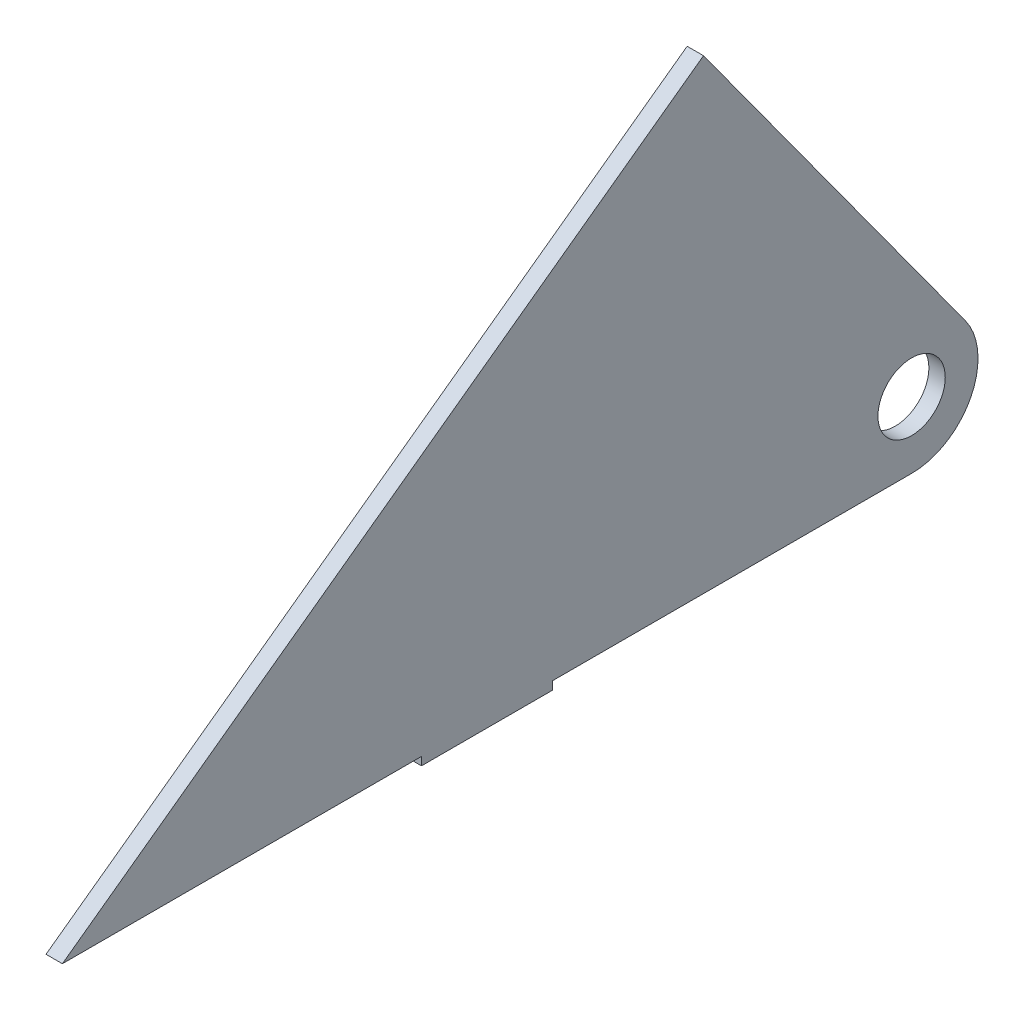
ISO-10303-21;
HEADER;
FILE_DESCRIPTION(('STEP AP214'),'2;1');
FILE_NAME('part.step','',(''),(''),'','','');
FILE_SCHEMA(('AUTOMOTIVE_DESIGN { 1 0 10303 214 1 1 1 1 }'));
ENDSEC;
DATA;
#1=APPLICATION_CONTEXT('core data for automotive mechanical design processes');
#2=APPLICATION_PROTOCOL_DEFINITION('international standard','automotive_design',2000,#1);
#3=PRODUCT_CONTEXT('',#1,'mechanical');
#4=PRODUCT('Part','Part','',(#3));
#5=PRODUCT_RELATED_PRODUCT_CATEGORY('part','',(#4));
#6=PRODUCT_DEFINITION_FORMATION('','',#4);
#7=PRODUCT_DEFINITION_CONTEXT('part definition',#1,'design');
#8=PRODUCT_DEFINITION('design','',#6,#7);
#9=PRODUCT_DEFINITION_SHAPE('','',#8);
#10=(LENGTH_UNIT() NAMED_UNIT(*) SI_UNIT(.MILLI.,.METRE.));
#11=(NAMED_UNIT(*) PLANE_ANGLE_UNIT() SI_UNIT($,.RADIAN.));
#12=(NAMED_UNIT(*) SI_UNIT($,.STERADIAN.) SOLID_ANGLE_UNIT());
#13=UNCERTAINTY_MEASURE_WITH_UNIT(LENGTH_MEASURE(1.E-05),#10,'distance_accuracy_value','');
#14=(GEOMETRIC_REPRESENTATION_CONTEXT(3) GLOBAL_UNCERTAINTY_ASSIGNED_CONTEXT((#13)) GLOBAL_UNIT_ASSIGNED_CONTEXT((#10,
#11,#12)) REPRESENTATION_CONTEXT('',''));
#15=CARTESIAN_POINT('',(0.,0.,0.));
#16=DIRECTION('',(0.,0.,1.));
#17=DIRECTION('',(1.,0.,0.));
#18=AXIS2_PLACEMENT_3D('',#15,#16,#17);
#19=CARTESIAN_POINT('',(0.79375,3.78469046098594,-5.20917952508089));
#20=DIRECTION('',(0.,0.587785252292463,-0.809016994374954));
#21=DIRECTION('',(0.,0.809016994374955,0.587785252292463));
#22=AXIS2_PLACEMENT_3D('',#19,#20,#21);
#23=PLANE('',#22);
#24=DIRECTION('',(0.,-0.809016994374954,-0.587785252292463));
#25=VECTOR('',#24,1.);
#26=CARTESIAN_POINT('',(-0.79375,3.78469046098594,-5.20917952508089));
#27=LINE('',#26,#25);
#28=CARTESIAN_POINT('',(-0.79375,38.7180442780965,20.1713876689077));
#29=VERTEX_POINT('',#28);
#30=CARTESIAN_POINT('',(-0.79375,3.78469046098594,-5.20917952508089));
#31=VERTEX_POINT('',#30);
#32=EDGE_CURVE('E173',#29,#31,#27,.T.);
#33=ORIENTED_EDGE('',*,*,#32,.F.);
#34=DIRECTION('',(-1.,0.,0.));
#35=VECTOR('',#34,1.);
#36=CARTESIAN_POINT('',(0.79375,38.7180442780965,20.1713876689077));
#37=LINE('',#36,#35);
#38=CARTESIAN_POINT('',(0.79375,38.7180442780965,20.1713876689077));
#39=VERTEX_POINT('',#38);
#40=EDGE_CURVE('E11',#39,#29,#37,.T.);
#41=ORIENTED_EDGE('',*,*,#40,.F.);
#42=DIRECTION('',(0.,-0.809016994374954,-0.587785252292463));
#43=VECTOR('',#42,1.);
#44=CARTESIAN_POINT('',(0.79375,3.78469046098594,-5.20917952508089));
#45=LINE('',#44,#43);
#46=CARTESIAN_POINT('',(0.79375,3.78469046098594,-5.20917952508089));
#47=VERTEX_POINT('',#46);
#48=EDGE_CURVE('E142',#39,#47,#45,.T.);
#49=ORIENTED_EDGE('',*,*,#48,.T.);
#50=DIRECTION('',(-1.,0.,0.));
#51=VECTOR('',#50,1.);
#52=CARTESIAN_POINT('',(0.79375,3.78469046098594,-5.20917952508089));
#53=LINE('',#52,#51);
#54=EDGE_CURVE('E88',#47,#31,#53,.T.);
#55=ORIENTED_EDGE('',*,*,#54,.T.);
#56=EDGE_LOOP('',(#33,#41,#49,#55));
#57=FACE_BOUND('',#56,.T.);
#58=ADVANCED_FACE('F38',(#57),#23,.T.);
#59=CARTESIAN_POINT('',(0.79375,34.9333538171105,25.3805671939886));
#60=DIRECTION('',(0.,-0.809016994374954,-0.587785252292463));
#61=DIRECTION('',(0.,0.587785252292463,-0.809016994374955));
#62=AXIS2_PLACEMENT_3D('',#59,#60,#61);
#63=PLANE('',#62);
#64=DIRECTION('',(0.,-0.587785252292463,0.809016994374955));
#65=VECTOR('',#64,1.);
#66=CARTESIAN_POINT('',(-0.79375,34.9333538171105,25.3805671939886));
#67=LINE('',#66,#65);
#68=CARTESIAN_POINT('',(-0.79375,-6.43890000000002,82.3245893570055));
#69=VERTEX_POINT('',#68);
#70=EDGE_CURVE('E169',#29,#69,#67,.T.);
#71=ORIENTED_EDGE('',*,*,#70,.T.);
#72=DIRECTION('',(-1.,0.,0.));
#73=VECTOR('',#72,1.);
#74=CARTESIAN_POINT('',(0.79375,-6.43890000000002,82.3245893570055));
#75=LINE('',#74,#73);
#76=CARTESIAN_POINT('',(0.79375,-6.43890000000002,82.3245893570055));
#77=VERTEX_POINT('',#76);
#78=EDGE_CURVE('E46',#77,#69,#75,.T.);
#79=ORIENTED_EDGE('',*,*,#78,.F.);
#80=DIRECTION('',(0.,-0.587785252292463,0.809016994374955));
#81=VECTOR('',#80,1.);
#82=CARTESIAN_POINT('',(0.79375,34.9333538171105,25.3805671939886));
#83=LINE('',#82,#81);
#84=EDGE_CURVE('E138',#39,#77,#83,.T.);
#85=ORIENTED_EDGE('',*,*,#84,.F.);
#86=ORIENTED_EDGE('',*,*,#40,.T.);
#87=EDGE_LOOP('',(#71,#79,#85,#86));
#88=FACE_BOUND('',#87,.T.);
#89=ADVANCED_FACE('F170',(#88),#63,.F.);
#90=CARTESIAN_POINT('',(0.79375,-6.4389,0.));
#91=DIRECTION('',(0.,-1.,0.));
#92=DIRECTION('',(0.,0.,-1.));
#93=AXIS2_PLACEMENT_3D('',#90,#91,#92);
#94=PLANE('',#93);
#95=DIRECTION('',(0.,0.,1.));
#96=VECTOR('',#95,1.);
#97=CARTESIAN_POINT('',(-0.79375,-6.4389,0.));
#98=LINE('',#97,#96);
#99=CARTESIAN_POINT('',(-0.79375,-6.43890000000001,47.5122946785027));
#100=VERTEX_POINT('',#99);
#101=EDGE_CURVE('E165',#100,#69,#98,.T.);
#102=ORIENTED_EDGE('',*,*,#101,.F.);
#103=DIRECTION('',(-1.,0.,0.));
#104=VECTOR('',#103,1.);
#105=CARTESIAN_POINT('',(0.79375,-6.43890000000001,47.5122946785027));
#106=LINE('',#105,#104);
#107=CARTESIAN_POINT('',(0.79375,-6.43890000000001,47.5122946785027));
#108=VERTEX_POINT('',#107);
#109=EDGE_CURVE('E160',#108,#100,#106,.T.);
#110=ORIENTED_EDGE('',*,*,#109,.F.);
#111=DIRECTION('',(0.,0.,1.));
#112=VECTOR('',#111,1.);
#113=CARTESIAN_POINT('',(0.79375,-6.4389,0.));
#114=LINE('',#113,#112);
#115=EDGE_CURVE('E131',#108,#77,#114,.T.);
#116=ORIENTED_EDGE('',*,*,#115,.T.);
#117=ORIENTED_EDGE('',*,*,#78,.T.);
#118=EDGE_LOOP('',(#102,#110,#116,#117));
#119=FACE_BOUND('',#118,.T.);
#120=ADVANCED_FACE('F163',(#119),#94,.T.);
#121=CARTESIAN_POINT('',(0.79375,0.,47.5122946785027));
#122=DIRECTION('',(0.,0.,1.));
#123=DIRECTION('',(1.,0.,0.));
#124=AXIS2_PLACEMENT_3D('',#121,#122,#123);
#125=PLANE('',#124);
#126=DIRECTION('',(0.,1.,0.));
#127=VECTOR('',#126,1.);
#128=CARTESIAN_POINT('',(-0.79375,0.,47.5122946785027));
#129=LINE('',#128,#127);
#130=CARTESIAN_POINT('',(-0.79375,-7.23265,47.5122946785027));
#131=VERTEX_POINT('',#130);
#132=EDGE_CURVE('E178',#131,#100,#129,.T.);
#133=ORIENTED_EDGE('',*,*,#132,.F.);
#134=DIRECTION('',(-1.,0.,0.));
#135=VECTOR('',#134,1.);
#136=CARTESIAN_POINT('',(0.79375,-7.23265,47.5122946785027));
#137=LINE('',#136,#135);
#138=CARTESIAN_POINT('',(0.79375,-7.23265,47.5122946785027));
#139=VERTEX_POINT('',#138);
#140=EDGE_CURVE('E158',#139,#131,#137,.T.);
#141=ORIENTED_EDGE('',*,*,#140,.F.);
#142=DIRECTION('',(0.,1.,0.));
#143=VECTOR('',#142,1.);
#144=CARTESIAN_POINT('',(0.79375,0.,47.5122946785027));
#145=LINE('',#144,#143);
#146=EDGE_CURVE('E137',#139,#108,#145,.T.);
#147=ORIENTED_EDGE('',*,*,#146,.T.);
#148=ORIENTED_EDGE('',*,*,#109,.T.);
#149=EDGE_LOOP('',(#133,#141,#147,#148));
#150=FACE_BOUND('',#149,.T.);
#151=ADVANCED_FACE('F186',(#150),#125,.T.);
#152=CARTESIAN_POINT('',(0.79375,-7.23265,0.));
#153=DIRECTION('',(0.,1.,0.));
#154=DIRECTION('',(0.,0.,1.));
#155=AXIS2_PLACEMENT_3D('',#152,#153,#154);
#156=PLANE('',#155);
#157=DIRECTION('',(0.,0.,-1.));
#158=VECTOR('',#157,1.);
#159=CARTESIAN_POINT('',(-0.79375,-7.23265,0.));
#160=LINE('',#159,#158);
#161=CARTESIAN_POINT('',(-0.79375,-7.23265,34.8122946785027));
#162=VERTEX_POINT('',#161);
#163=EDGE_CURVE('E180',#131,#162,#160,.T.);
#164=ORIENTED_EDGE('',*,*,#163,.T.);
#165=DIRECTION('',(-1.,0.,0.));
#166=VECTOR('',#165,1.);
#167=CARTESIAN_POINT('',(0.79375,-7.23265,34.8122946785027));
#168=LINE('',#167,#166);
#169=CARTESIAN_POINT('',(0.79375,-7.23265,34.8122946785027));
#170=VERTEX_POINT('',#169);
#171=EDGE_CURVE('E127',#170,#162,#168,.T.);
#172=ORIENTED_EDGE('',*,*,#171,.F.);
#173=DIRECTION('',(0.,0.,-1.));
#174=VECTOR('',#173,1.);
#175=CARTESIAN_POINT('',(0.79375,-7.23265,0.));
#176=LINE('',#175,#174);
#177=EDGE_CURVE('E114',#139,#170,#176,.T.);
#178=ORIENTED_EDGE('',*,*,#177,.F.);
#179=ORIENTED_EDGE('',*,*,#140,.T.);
#180=EDGE_LOOP('',(#164,#172,#178,#179));
#181=FACE_BOUND('',#180,.T.);
#182=ADVANCED_FACE('F184',(#181),#156,.F.);
#183=CARTESIAN_POINT('',(0.79375,0.,34.8122946785027));
#184=DIRECTION('',(0.,0.,1.));
#185=DIRECTION('',(1.,0.,0.));
#186=AXIS2_PLACEMENT_3D('',#183,#184,#185);
#187=PLANE('',#186);
#188=DIRECTION('',(0.,1.,0.));
#189=VECTOR('',#188,1.);
#190=CARTESIAN_POINT('',(-0.79375,0.,34.8122946785027));
#191=LINE('',#190,#189);
#192=CARTESIAN_POINT('',(-0.79375,-6.4389,34.8122946785027));
#193=VERTEX_POINT('',#192);
#194=EDGE_CURVE('E123',#162,#193,#191,.T.);
#195=ORIENTED_EDGE('',*,*,#194,.T.);
#196=DIRECTION('',(-1.,0.,0.));
#197=VECTOR('',#196,1.);
#198=CARTESIAN_POINT('',(0.79375,-6.4389,34.8122946785027));
#199=LINE('',#198,#197);
#200=CARTESIAN_POINT('',(0.79375,-6.4389,34.8122946785027));
#201=VERTEX_POINT('',#200);
#202=EDGE_CURVE('E120',#201,#193,#199,.T.);
#203=ORIENTED_EDGE('',*,*,#202,.F.);
#204=DIRECTION('',(0.,1.,0.));
#205=VECTOR('',#204,1.);
#206=CARTESIAN_POINT('',(0.79375,0.,34.8122946785027));
#207=LINE('',#206,#205);
#208=EDGE_CURVE('E106',#170,#201,#207,.T.);
#209=ORIENTED_EDGE('',*,*,#208,.F.);
#210=ORIENTED_EDGE('',*,*,#171,.T.);
#211=EDGE_LOOP('',(#195,#203,#209,#210));
#212=FACE_BOUND('',#211,.T.);
#213=ADVANCED_FACE('F121',(#212),#187,.F.);
#214=CARTESIAN_POINT('',(-0.79375,-6.4389,0.));
#215=VERTEX_POINT('',#214);
#216=EDGE_CURVE('E151',#215,#193,#98,.T.);
#217=ORIENTED_EDGE('',*,*,#216,.F.);
#218=DIRECTION('',(-1.,0.,0.));
#219=VECTOR('',#218,1.);
#220=CARTESIAN_POINT('',(0.79375,-6.4389,0.));
#221=LINE('',#220,#219);
#222=CARTESIAN_POINT('',(0.79375,-6.4389,0.));
#223=VERTEX_POINT('',#222);
#224=EDGE_CURVE('E81',#223,#215,#221,.T.);
#225=ORIENTED_EDGE('',*,*,#224,.F.);
#226=EDGE_CURVE('E111',#223,#201,#114,.T.);
#227=ORIENTED_EDGE('',*,*,#226,.T.);
#228=ORIENTED_EDGE('',*,*,#202,.T.);
#229=EDGE_LOOP('',(#217,#225,#227,#228));
#230=FACE_BOUND('',#229,.T.);
#231=ADVANCED_FACE('F129',(#230),#94,.T.);
#232=CARTESIAN_POINT('',(0.79375,0.,0.));
#233=DIRECTION('',(-1.,0.,0.));
#234=DIRECTION('',(0.,0.,1.));
#235=AXIS2_PLACEMENT_3D('',#232,#233,#234);
#236=CYLINDRICAL_SURFACE('',#235,6.43890000000001);
#237=CARTESIAN_POINT('',(-0.79375,0.,0.));
#238=DIRECTION('',(1.,0.,0.));
#239=DIRECTION('',(0.,0.,-1.));
#240=AXIS2_PLACEMENT_3D('',#237,#238,#239);
#241=CIRCLE('',#240,6.43890000000001);
#242=EDGE_CURVE('E147',#215,#31,#241,.T.);
#243=ORIENTED_EDGE('',*,*,#242,.T.);
#244=ORIENTED_EDGE('',*,*,#54,.F.);
#245=CARTESIAN_POINT('',(0.79375,0.,0.));
#246=DIRECTION('',(1.,0.,0.));
#247=DIRECTION('',(0.,0.,-1.));
#248=AXIS2_PLACEMENT_3D('',#245,#246,#247);
#249=CIRCLE('',#248,6.43890000000001);
#250=EDGE_CURVE('E54',#223,#47,#249,.T.);
#251=ORIENTED_EDGE('',*,*,#250,.F.);
#252=ORIENTED_EDGE('',*,*,#224,.T.);
#253=EDGE_LOOP('',(#243,#244,#251,#252));
#254=FACE_BOUND('',#253,.T.);
#255=ADVANCED_FACE('F207',(#254),#236,.T.);
#256=CARTESIAN_POINT('',(0.79375,0.,0.));
#257=DIRECTION('',(-1.,0.,0.));
#258=DIRECTION('',(0.,0.,1.));
#259=AXIS2_PLACEMENT_3D('',#256,#257,#258);
#260=CYLINDRICAL_SURFACE('',#259,3.2639);
#261=CARTESIAN_POINT('',(0.79375,0.,0.));
#262=DIRECTION('',(1.,0.,0.));
#263=DIRECTION('',(0.,0.,-1.));
#264=AXIS2_PLACEMENT_3D('',#261,#262,#263);
#265=CIRCLE('',#264,3.2639);
#266=CARTESIAN_POINT('',(0.79375,0.,-3.2639));
#267=VERTEX_POINT('',#266);
#268=EDGE_CURVE('E132',#267,#267,#265,.T.);
#269=ORIENTED_EDGE('',*,*,#268,.T.);
#270=EDGE_LOOP('',(#269));
#271=FACE_BOUND('',#270,.T.);
#272=CARTESIAN_POINT('',(-0.79375,0.,0.));
#273=DIRECTION('',(1.,0.,0.));
#274=DIRECTION('',(0.,0.,-1.));
#275=AXIS2_PLACEMENT_3D('',#272,#273,#274);
#276=CIRCLE('',#275,3.2639);
#277=CARTESIAN_POINT('',(-0.79375,0.,-3.2639));
#278=VERTEX_POINT('',#277);
#279=EDGE_CURVE('E144',#278,#278,#276,.T.);
#280=ORIENTED_EDGE('',*,*,#279,.F.);
#281=EDGE_LOOP('',(#280));
#282=FACE_BOUND('',#281,.T.);
#283=ADVANCED_FACE('F210',(#271,#282),#260,.F.);
#284=CARTESIAN_POINT('',(0.79375,0.,0.));
#285=DIRECTION('',(1.,0.,0.));
#286=DIRECTION('',(0.,0.,-1.));
#287=AXIS2_PLACEMENT_3D('',#284,#285,#286);
#288=PLANE('',#287);
#289=ORIENTED_EDGE('',*,*,#48,.F.);
#290=ORIENTED_EDGE('',*,*,#84,.T.);
#291=ORIENTED_EDGE('',*,*,#115,.F.);
#292=ORIENTED_EDGE('',*,*,#146,.F.);
#293=ORIENTED_EDGE('',*,*,#177,.T.);
#294=ORIENTED_EDGE('',*,*,#208,.T.);
#295=ORIENTED_EDGE('',*,*,#226,.F.);
#296=ORIENTED_EDGE('',*,*,#250,.T.);
#297=EDGE_LOOP('',(#289,#290,#291,#292,#293,#294,#295,#296));
#298=FACE_BOUND('',#297,.T.);
#299=ORIENTED_EDGE('',*,*,#268,.F.);
#300=EDGE_LOOP('',(#299));
#301=FACE_BOUND('',#300,.T.);
#302=ADVANCED_FACE('F108',(#298,#301),#288,.T.);
#303=CARTESIAN_POINT('',(-0.79375,0.,0.));
#304=DIRECTION('',(1.,0.,0.));
#305=DIRECTION('',(0.,0.,-1.));
#306=AXIS2_PLACEMENT_3D('',#303,#304,#305);
#307=PLANE('',#306);
#308=ORIENTED_EDGE('',*,*,#32,.T.);
#309=ORIENTED_EDGE('',*,*,#242,.F.);
#310=ORIENTED_EDGE('',*,*,#216,.T.);
#311=ORIENTED_EDGE('',*,*,#194,.F.);
#312=ORIENTED_EDGE('',*,*,#163,.F.);
#313=ORIENTED_EDGE('',*,*,#132,.T.);
#314=ORIENTED_EDGE('',*,*,#101,.T.);
#315=ORIENTED_EDGE('',*,*,#70,.F.);
#316=EDGE_LOOP('',(#308,#309,#310,#311,#312,#313,#314,#315));
#317=FACE_BOUND('',#316,.T.);
#318=ORIENTED_EDGE('',*,*,#279,.T.);
#319=EDGE_LOOP('',(#318));
#320=FACE_BOUND('',#319,.T.);
#321=ADVANCED_FACE('F175',(#317,#320),#307,.F.);
#322=CLOSED_SHELL('',(#58,#89,#120,#151,#182,#213,#231,#255,#283,#302,#321));
#323=MANIFOLD_SOLID_BREP('B2',#322);
#324=ADVANCED_BREP_SHAPE_REPRESENTATION('',(#18,#323),#14);
#325=SHAPE_DEFINITION_REPRESENTATION(#9,#324);
ENDSEC;
END-ISO-10303-21;
